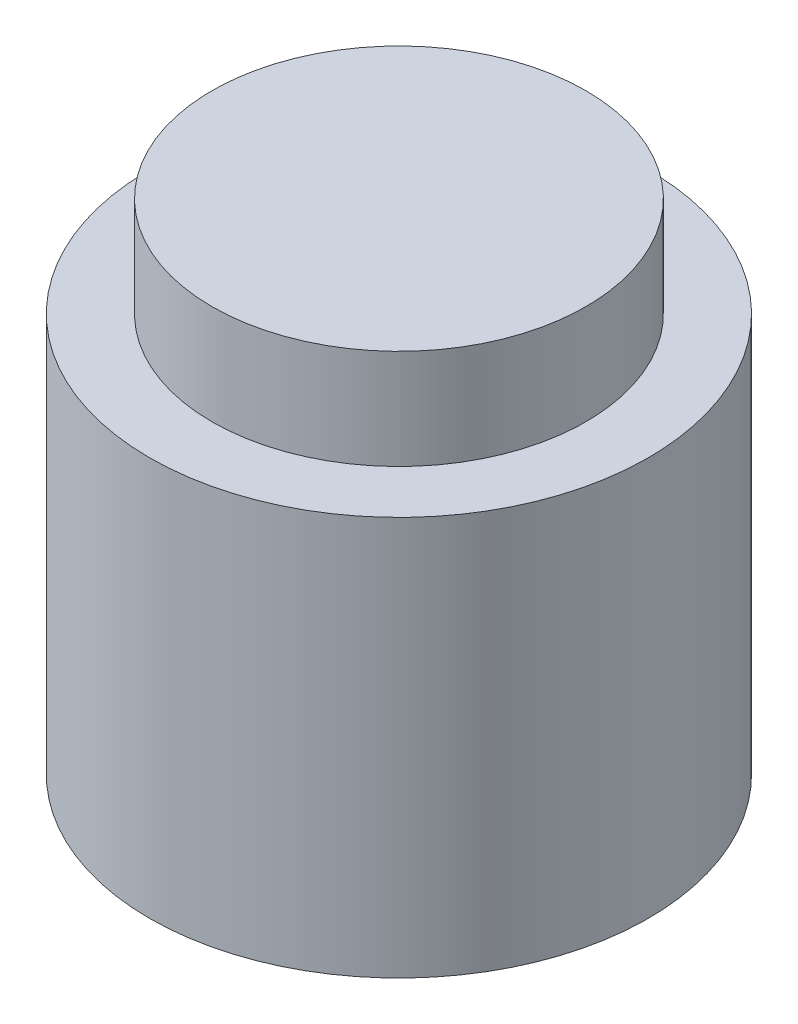
ISO-10303-21;
HEADER;
FILE_DESCRIPTION(('STEP AP214'),'2;1');
FILE_NAME('part.step','',(''),(''),'','','');
FILE_SCHEMA(('AUTOMOTIVE_DESIGN { 1 0 10303 214 1 1 1 1 }'));
ENDSEC;
DATA;
#1=APPLICATION_CONTEXT('core data for automotive mechanical design processes');
#2=APPLICATION_PROTOCOL_DEFINITION('international standard','automotive_design',2000,#1);
#3=PRODUCT_CONTEXT('',#1,'mechanical');
#4=PRODUCT('Part','Part','',(#3));
#5=PRODUCT_RELATED_PRODUCT_CATEGORY('part','',(#4));
#6=PRODUCT_DEFINITION_FORMATION('','',#4);
#7=PRODUCT_DEFINITION_CONTEXT('part definition',#1,'design');
#8=PRODUCT_DEFINITION('design','',#6,#7);
#9=PRODUCT_DEFINITION_SHAPE('','',#8);
#10=(LENGTH_UNIT() NAMED_UNIT(*) SI_UNIT(.MILLI.,.METRE.));
#11=(NAMED_UNIT(*) PLANE_ANGLE_UNIT() SI_UNIT($,.RADIAN.));
#12=(NAMED_UNIT(*) SI_UNIT($,.STERADIAN.) SOLID_ANGLE_UNIT());
#13=UNCERTAINTY_MEASURE_WITH_UNIT(LENGTH_MEASURE(1.E-05),#10,'distance_accuracy_value','');
#14=(GEOMETRIC_REPRESENTATION_CONTEXT(3) GLOBAL_UNCERTAINTY_ASSIGNED_CONTEXT((#13)) GLOBAL_UNIT_ASSIGNED_CONTEXT((#10,
#11,#12)) REPRESENTATION_CONTEXT('',''));
#15=CARTESIAN_POINT('',(0.,0.,0.));
#16=DIRECTION('',(0.,0.,1.));
#17=DIRECTION('',(1.,0.,0.));
#18=AXIS2_PLACEMENT_3D('',#15,#16,#17);
#19=CARTESIAN_POINT('',(0.,6.,-1.75));
#20=DIRECTION('',(0.,0.,-1.));
#21=DIRECTION('',(-1.,0.,0.));
#22=AXIS2_PLACEMENT_3D('',#19,#20,#21);
#23=PLANE('',#22);
#24=DIRECTION('',(1.,0.,0.));
#25=VECTOR('',#24,1.);
#26=CARTESIAN_POINT('',(0.,0.,-1.75));
#27=LINE('',#26,#25);
#28=CARTESIAN_POINT('',(-2.43669858620224,0.,-1.75));
#29=VERTEX_POINT('',#28);
#30=CARTESIAN_POINT('',(2.43669858620224,0.,-1.75));
#31=VERTEX_POINT('',#30);
#32=EDGE_CURVE('E89',#29,#31,#27,.T.);
#33=ORIENTED_EDGE('',*,*,#32,.T.);
#34=DIRECTION('',(0.,-1.,0.));
#35=VECTOR('',#34,1.);
#36=CARTESIAN_POINT('',(2.43669858620224,6.,-1.75));
#37=LINE('',#36,#35);
#38=CARTESIAN_POINT('',(2.43669858620224,6.,-1.75));
#39=VERTEX_POINT('',#38);
#40=EDGE_CURVE('E11',#39,#31,#37,.T.);
#41=ORIENTED_EDGE('',*,*,#40,.F.);
#42=DIRECTION('',(1.,0.,0.));
#43=VECTOR('',#42,1.);
#44=CARTESIAN_POINT('',(0.,6.,-1.75));
#45=LINE('',#44,#43);
#46=CARTESIAN_POINT('',(-2.43669858620224,6.,-1.75));
#47=VERTEX_POINT('',#46);
#48=EDGE_CURVE('E93',#47,#39,#45,.T.);
#49=ORIENTED_EDGE('',*,*,#48,.F.);
#50=DIRECTION('',(0.,-1.,0.));
#51=VECTOR('',#50,1.);
#52=CARTESIAN_POINT('',(-2.43669858620224,6.,-1.75));
#53=LINE('',#52,#51);
#54=EDGE_CURVE('E74',#47,#29,#53,.T.);
#55=ORIENTED_EDGE('',*,*,#54,.T.);
#56=EDGE_LOOP('',(#33,#41,#49,#55));
#57=FACE_BOUND('',#56,.T.);
#58=ADVANCED_FACE('F35',(#57),#23,.F.);
#59=CARTESIAN_POINT('',(0.,6.,0.));
#60=DIRECTION('',(0.,-1.,0.));
#61=DIRECTION('',(0.,0.,-1.));
#62=AXIS2_PLACEMENT_3D('',#59,#60,#61);
#63=CYLINDRICAL_SURFACE('',#62,3.);
#64=CARTESIAN_POINT('',(0.,0.,0.));
#65=DIRECTION('',(0.,1.,0.));
#66=DIRECTION('',(0.,0.,1.));
#67=AXIS2_PLACEMENT_3D('',#64,#65,#66);
#68=CIRCLE('',#67,3.);
#69=CARTESIAN_POINT('',(2.43669858620224,0.,1.75));
#70=VERTEX_POINT('',#69);
#71=EDGE_CURVE('E83',#70,#31,#68,.T.);
#72=ORIENTED_EDGE('',*,*,#71,.F.);
#73=DIRECTION('',(0.,-1.,0.));
#74=VECTOR('',#73,1.);
#75=CARTESIAN_POINT('',(2.43669858620224,6.,1.75));
#76=LINE('',#75,#74);
#77=CARTESIAN_POINT('',(2.43669858620224,6.,1.75));
#78=VERTEX_POINT('',#77);
#79=EDGE_CURVE('E43',#78,#70,#76,.T.);
#80=ORIENTED_EDGE('',*,*,#79,.F.);
#81=CARTESIAN_POINT('',(0.,6.,0.));
#82=DIRECTION('',(0.,1.,0.));
#83=DIRECTION('',(0.,0.,1.));
#84=AXIS2_PLACEMENT_3D('',#81,#82,#83);
#85=CIRCLE('',#84,3.);
#86=EDGE_CURVE('E104',#78,#39,#85,.T.);
#87=ORIENTED_EDGE('',*,*,#86,.T.);
#88=ORIENTED_EDGE('',*,*,#40,.T.);
#89=EDGE_LOOP('',(#72,#80,#87,#88));
#90=FACE_BOUND('',#89,.T.);
#91=ADVANCED_FACE('F140',(#90),#63,.F.);
#92=CARTESIAN_POINT('',(0.,6.,1.75));
#93=DIRECTION('',(0.,0.,-1.));
#94=DIRECTION('',(-1.,0.,0.));
#95=AXIS2_PLACEMENT_3D('',#92,#93,#94);
#96=PLANE('',#95);
#97=DIRECTION('',(1.,0.,0.));
#98=VECTOR('',#97,1.);
#99=CARTESIAN_POINT('',(0.,0.,1.75));
#100=LINE('',#99,#98);
#101=CARTESIAN_POINT('',(-2.43669858620224,0.,1.75));
#102=VERTEX_POINT('',#101);
#103=EDGE_CURVE('E77',#102,#70,#100,.T.);
#104=ORIENTED_EDGE('',*,*,#103,.F.);
#105=DIRECTION('',(0.,-1.,0.));
#106=VECTOR('',#105,1.);
#107=CARTESIAN_POINT('',(-2.43669858620224,6.,1.75));
#108=LINE('',#107,#106);
#109=CARTESIAN_POINT('',(-2.43669858620224,6.,1.75));
#110=VERTEX_POINT('',#109);
#111=EDGE_CURVE('E66',#110,#102,#108,.T.);
#112=ORIENTED_EDGE('',*,*,#111,.F.);
#113=DIRECTION('',(1.,0.,0.));
#114=VECTOR('',#113,1.);
#115=CARTESIAN_POINT('',(0.,6.,1.75));
#116=LINE('',#115,#114);
#117=EDGE_CURVE('E50',#110,#78,#116,.T.);
#118=ORIENTED_EDGE('',*,*,#117,.T.);
#119=ORIENTED_EDGE('',*,*,#79,.T.);
#120=EDGE_LOOP('',(#104,#112,#118,#119));
#121=FACE_BOUND('',#120,.T.);
#122=ADVANCED_FACE('F78',(#121),#96,.T.);
#123=EDGE_CURVE('E71',#29,#102,#68,.T.);
#124=ORIENTED_EDGE('',*,*,#123,.F.);
#125=ORIENTED_EDGE('',*,*,#54,.F.);
#126=EDGE_CURVE('E72',#47,#110,#85,.T.);
#127=ORIENTED_EDGE('',*,*,#126,.T.);
#128=ORIENTED_EDGE('',*,*,#111,.T.);
#129=EDGE_LOOP('',(#124,#125,#127,#128));
#130=FACE_BOUND('',#129,.T.);
#131=ADVANCED_FACE('F68',(#130),#63,.F.);
#132=CARTESIAN_POINT('',(0.,6.,0.));
#133=DIRECTION('',(0.,-1.,0.));
#134=DIRECTION('',(0.,0.,-1.));
#135=AXIS2_PLACEMENT_3D('',#132,#133,#134);
#136=CYLINDRICAL_SURFACE('',#135,5.);
#137=CARTESIAN_POINT('',(0.,0.,0.));
#138=DIRECTION('',(0.,1.,0.));
#139=DIRECTION('',(0.,0.,1.));
#140=AXIS2_PLACEMENT_3D('',#137,#138,#139);
#141=CIRCLE('',#140,5.);
#142=CARTESIAN_POINT('',(0.,0.,5.));
#143=VERTEX_POINT('',#142);
#144=EDGE_CURVE('E90',#143,#143,#141,.T.);
#145=ORIENTED_EDGE('',*,*,#144,.T.);
#146=EDGE_LOOP('',(#145));
#147=FACE_BOUND('',#146,.T.);
#148=CARTESIAN_POINT('',(0.,8.,0.));
#149=DIRECTION('',(0.,1.,0.));
#150=DIRECTION('',(0.,0.,1.));
#151=AXIS2_PLACEMENT_3D('',#148,#149,#150);
#152=CIRCLE('',#151,5.);
#153=CARTESIAN_POINT('',(0.,8.,5.));
#154=VERTEX_POINT('',#153);
#155=EDGE_CURVE('E96',#154,#154,#152,.T.);
#156=ORIENTED_EDGE('',*,*,#155,.F.);
#157=EDGE_LOOP('',(#156));
#158=FACE_BOUND('',#157,.T.);
#159=ADVANCED_FACE('F130',(#147,#158),#136,.T.);
#160=CARTESIAN_POINT('',(0.,0.,0.));
#161=DIRECTION('',(0.,1.,0.));
#162=DIRECTION('',(0.,0.,1.));
#163=AXIS2_PLACEMENT_3D('',#160,#161,#162);
#164=PLANE('',#163);
#165=ORIENTED_EDGE('',*,*,#32,.F.);
#166=ORIENTED_EDGE('',*,*,#123,.T.);
#167=ORIENTED_EDGE('',*,*,#103,.T.);
#168=ORIENTED_EDGE('',*,*,#71,.T.);
#169=EDGE_LOOP('',(#165,#166,#167,#168));
#170=FACE_BOUND('',#169,.T.);
#171=ORIENTED_EDGE('',*,*,#144,.F.);
#172=EDGE_LOOP('',(#171));
#173=FACE_BOUND('',#172,.T.);
#174=ADVANCED_FACE('F86',(#170,#173),#164,.F.);
#175=CARTESIAN_POINT('',(0.,8.,0.));
#176=DIRECTION('',(0.,1.,0.));
#177=DIRECTION('',(0.,0.,1.));
#178=AXIS2_PLACEMENT_3D('',#175,#176,#177);
#179=PLANE('',#178);
#180=CARTESIAN_POINT('',(0.,8.,0.));
#181=DIRECTION('',(0.,1.,0.));
#182=DIRECTION('',(0.,0.,1.));
#183=AXIS2_PLACEMENT_3D('',#180,#181,#182);
#184=CIRCLE('',#183,3.75);
#185=CARTESIAN_POINT('',(0.,8.,3.75));
#186=VERTEX_POINT('',#185);
#187=EDGE_CURVE('E109',#186,#186,#184,.T.);
#188=ORIENTED_EDGE('',*,*,#187,.F.);
#189=EDGE_LOOP('',(#188));
#190=FACE_BOUND('',#189,.T.);
#191=ORIENTED_EDGE('',*,*,#155,.T.);
#192=EDGE_LOOP('',(#191));
#193=FACE_BOUND('',#192,.T.);
#194=ADVANCED_FACE('F124',(#190,#193),#179,.T.);
#195=CARTESIAN_POINT('',(0.,6.,0.));
#196=DIRECTION('',(0.,1.,0.));
#197=DIRECTION('',(0.,0.,1.));
#198=AXIS2_PLACEMENT_3D('',#195,#196,#197);
#199=PLANE('',#198);
#200=ORIENTED_EDGE('',*,*,#126,.F.);
#201=ORIENTED_EDGE('',*,*,#48,.T.);
#202=ORIENTED_EDGE('',*,*,#86,.F.);
#203=ORIENTED_EDGE('',*,*,#117,.F.);
#204=EDGE_LOOP('',(#200,#201,#202,#203));
#205=FACE_BOUND('',#204,.T.);
#206=ADVANCED_FACE('F120',(#205),#199,.F.);
#207=CARTESIAN_POINT('',(0.,10.,0.));
#208=DIRECTION('',(0.,-1.,0.));
#209=DIRECTION('',(0.,0.,-1.));
#210=AXIS2_PLACEMENT_3D('',#207,#208,#209);
#211=CYLINDRICAL_SURFACE('',#210,3.75);
#212=CARTESIAN_POINT('',(0.,10.,0.));
#213=DIRECTION('',(0.,1.,0.));
#214=DIRECTION('',(0.,0.,1.));
#215=AXIS2_PLACEMENT_3D('',#212,#213,#214);
#216=CIRCLE('',#215,3.75);
#217=CARTESIAN_POINT('',(0.,10.,3.75));
#218=VERTEX_POINT('',#217);
#219=EDGE_CURVE('E100',#218,#218,#216,.T.);
#220=ORIENTED_EDGE('',*,*,#219,.F.);
#221=EDGE_LOOP('',(#220));
#222=FACE_BOUND('',#221,.T.);
#223=ORIENTED_EDGE('',*,*,#187,.T.);
#224=EDGE_LOOP('',(#223));
#225=FACE_BOUND('',#224,.T.);
#226=ADVANCED_FACE('F117',(#222,#225),#211,.T.);
#227=CARTESIAN_POINT('',(0.,10.,0.));
#228=DIRECTION('',(0.,1.,0.));
#229=DIRECTION('',(0.,0.,1.));
#230=AXIS2_PLACEMENT_3D('',#227,#228,#229);
#231=PLANE('',#230);
#232=ORIENTED_EDGE('',*,*,#219,.T.);
#233=EDGE_LOOP('',(#232));
#234=FACE_BOUND('',#233,.T.);
#235=ADVANCED_FACE('F115',(#234),#231,.T.);
#236=CLOSED_SHELL('',(#58,#91,#122,#131,#159,#174,#194,#206,#226,#235));
#237=MANIFOLD_SOLID_BREP('B2',#236);
#238=ADVANCED_BREP_SHAPE_REPRESENTATION('',(#18,#237),#14);
#239=SHAPE_DEFINITION_REPRESENTATION(#9,#238);
ENDSEC;
END-ISO-10303-21;
